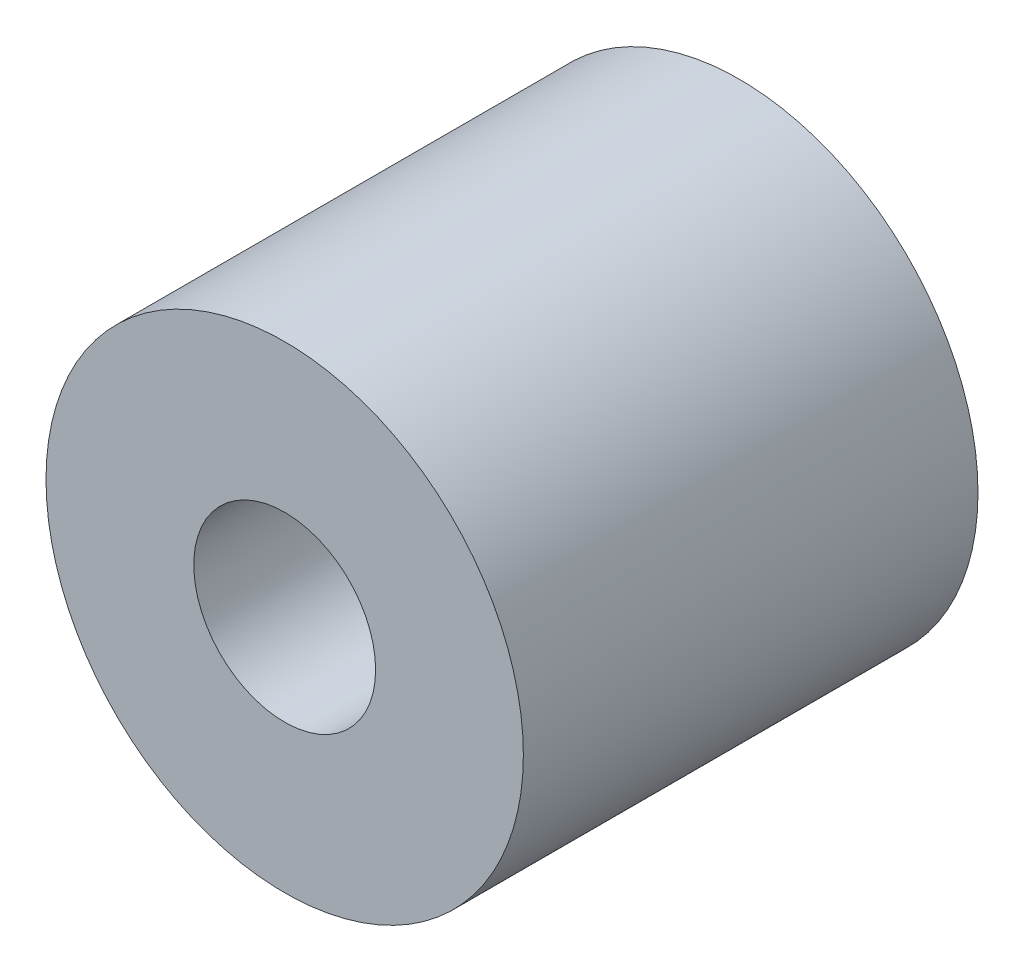
ISO-10303-21;
HEADER;
FILE_DESCRIPTION(('STEP AP214'),'2;1');
FILE_NAME('part.step','',(''),(''),'','','');
FILE_SCHEMA(('AUTOMOTIVE_DESIGN { 1 0 10303 214 1 1 1 1 }'));
ENDSEC;
DATA;
#1=APPLICATION_CONTEXT('core data for automotive mechanical design processes');
#2=APPLICATION_PROTOCOL_DEFINITION('international standard','automotive_design',2000,#1);
#3=PRODUCT_CONTEXT('',#1,'mechanical');
#4=PRODUCT('Part','Part','',(#3));
#5=PRODUCT_RELATED_PRODUCT_CATEGORY('part','',(#4));
#6=PRODUCT_DEFINITION_FORMATION('','',#4);
#7=PRODUCT_DEFINITION_CONTEXT('part definition',#1,'design');
#8=PRODUCT_DEFINITION('design','',#6,#7);
#9=PRODUCT_DEFINITION_SHAPE('','',#8);
#10=(LENGTH_UNIT() NAMED_UNIT(*) SI_UNIT(.MILLI.,.METRE.));
#11=(NAMED_UNIT(*) PLANE_ANGLE_UNIT() SI_UNIT($,.RADIAN.));
#12=(NAMED_UNIT(*) SI_UNIT($,.STERADIAN.) SOLID_ANGLE_UNIT());
#13=UNCERTAINTY_MEASURE_WITH_UNIT(LENGTH_MEASURE(1.E-05),#10,'distance_accuracy_value','');
#14=(GEOMETRIC_REPRESENTATION_CONTEXT(3) GLOBAL_UNCERTAINTY_ASSIGNED_CONTEXT((#13)) GLOBAL_UNIT_ASSIGNED_CONTEXT((#10,
#11,#12)) REPRESENTATION_CONTEXT('',''));
#15=CARTESIAN_POINT('',(0.,0.,0.));
#16=DIRECTION('',(0.,0.,1.));
#17=DIRECTION('',(1.,0.,0.));
#18=AXIS2_PLACEMENT_3D('',#15,#16,#17);
#19=CARTESIAN_POINT('',(0.,0.,20.));
#20=DIRECTION('',(0.,0.,-1.));
#21=DIRECTION('',(-1.,0.,0.));
#22=AXIS2_PLACEMENT_3D('',#19,#20,#21);
#23=CYLINDRICAL_SURFACE('',#22,10.5);
#24=CARTESIAN_POINT('',(0.,0.,20.));
#25=DIRECTION('',(0.,0.,1.));
#26=DIRECTION('',(1.,0.,0.));
#27=AXIS2_PLACEMENT_3D('',#24,#25,#26);
#28=CIRCLE('',#27,10.5);
#29=CARTESIAN_POINT('',(10.5,0.,20.));
#30=VERTEX_POINT('',#29);
#31=EDGE_CURVE('E10',#30,#30,#28,.T.);
#32=ORIENTED_EDGE('',*,*,#31,.F.);
#33=EDGE_LOOP('',(#32));
#34=FACE_BOUND('',#33,.T.);
#35=CARTESIAN_POINT('',(0.,0.,0.));
#36=DIRECTION('',(0.,0.,1.));
#37=DIRECTION('',(1.,0.,0.));
#38=AXIS2_PLACEMENT_3D('',#35,#36,#37);
#39=CIRCLE('',#38,10.5);
#40=CARTESIAN_POINT('',(10.5,0.,0.));
#41=VERTEX_POINT('',#40);
#42=EDGE_CURVE('E36',#41,#41,#39,.T.);
#43=ORIENTED_EDGE('',*,*,#42,.T.);
#44=EDGE_LOOP('',(#43));
#45=FACE_BOUND('',#44,.T.);
#46=ADVANCED_FACE('F33',(#34,#45),#23,.T.);
#47=CARTESIAN_POINT('',(0.,0.,20.));
#48=DIRECTION('',(0.,0.,1.));
#49=DIRECTION('',(1.,0.,0.));
#50=AXIS2_PLACEMENT_3D('',#47,#48,#49);
#51=PLANE('',#50);
#52=CARTESIAN_POINT('',(0.,0.,20.));
#53=DIRECTION('',(0.,0.,1.));
#54=DIRECTION('',(1.,0.,0.));
#55=AXIS2_PLACEMENT_3D('',#52,#53,#54);
#56=CIRCLE('',#55,4.);
#57=CARTESIAN_POINT('',(4.,0.,20.));
#58=VERTEX_POINT('',#57);
#59=EDGE_CURVE('E45',#58,#58,#56,.T.);
#60=ORIENTED_EDGE('',*,*,#59,.F.);
#61=EDGE_LOOP('',(#60));
#62=FACE_BOUND('',#61,.T.);
#63=ORIENTED_EDGE('',*,*,#31,.T.);
#64=EDGE_LOOP('',(#63));
#65=FACE_BOUND('',#64,.T.);
#66=ADVANCED_FACE('F60',(#62,#65),#51,.T.);
#67=CARTESIAN_POINT('',(0.,0.,0.));
#68=DIRECTION('',(0.,0.,1.));
#69=DIRECTION('',(1.,0.,0.));
#70=AXIS2_PLACEMENT_3D('',#67,#68,#69);
#71=PLANE('',#70);
#72=CARTESIAN_POINT('',(0.,0.,0.));
#73=DIRECTION('',(0.,0.,1.));
#74=DIRECTION('',(1.,0.,0.));
#75=AXIS2_PLACEMENT_3D('',#72,#73,#74);
#76=CIRCLE('',#75,4.);
#77=CARTESIAN_POINT('',(4.,0.,0.));
#78=VERTEX_POINT('',#77);
#79=EDGE_CURVE('E43',#78,#78,#76,.T.);
#80=ORIENTED_EDGE('',*,*,#79,.T.);
#81=EDGE_LOOP('',(#80));
#82=FACE_BOUND('',#81,.T.);
#83=ORIENTED_EDGE('',*,*,#42,.F.);
#84=EDGE_LOOP('',(#83));
#85=FACE_BOUND('',#84,.T.);
#86=ADVANCED_FACE('F51',(#82,#85),#71,.F.);
#87=CARTESIAN_POINT('',(0.,0.,0.));
#88=DIRECTION('',(0.,0.,1.));
#89=DIRECTION('',(1.,0.,0.));
#90=AXIS2_PLACEMENT_3D('',#87,#88,#89);
#91=CYLINDRICAL_SURFACE('',#90,4.);
#92=ORIENTED_EDGE('',*,*,#79,.F.);
#93=EDGE_LOOP('',(#92));
#94=FACE_BOUND('',#93,.T.);
#95=ORIENTED_EDGE('',*,*,#59,.T.);
#96=EDGE_LOOP('',(#95));
#97=FACE_BOUND('',#96,.T.);
#98=ADVANCED_FACE('F54',(#94,#97),#91,.F.);
#99=CLOSED_SHELL('',(#46,#66,#86,#98));
#100=MANIFOLD_SOLID_BREP('B2',#99);
#101=ADVANCED_BREP_SHAPE_REPRESENTATION('',(#18,#100),#14);
#102=SHAPE_DEFINITION_REPRESENTATION(#9,#101);
ENDSEC;
END-ISO-10303-21;
